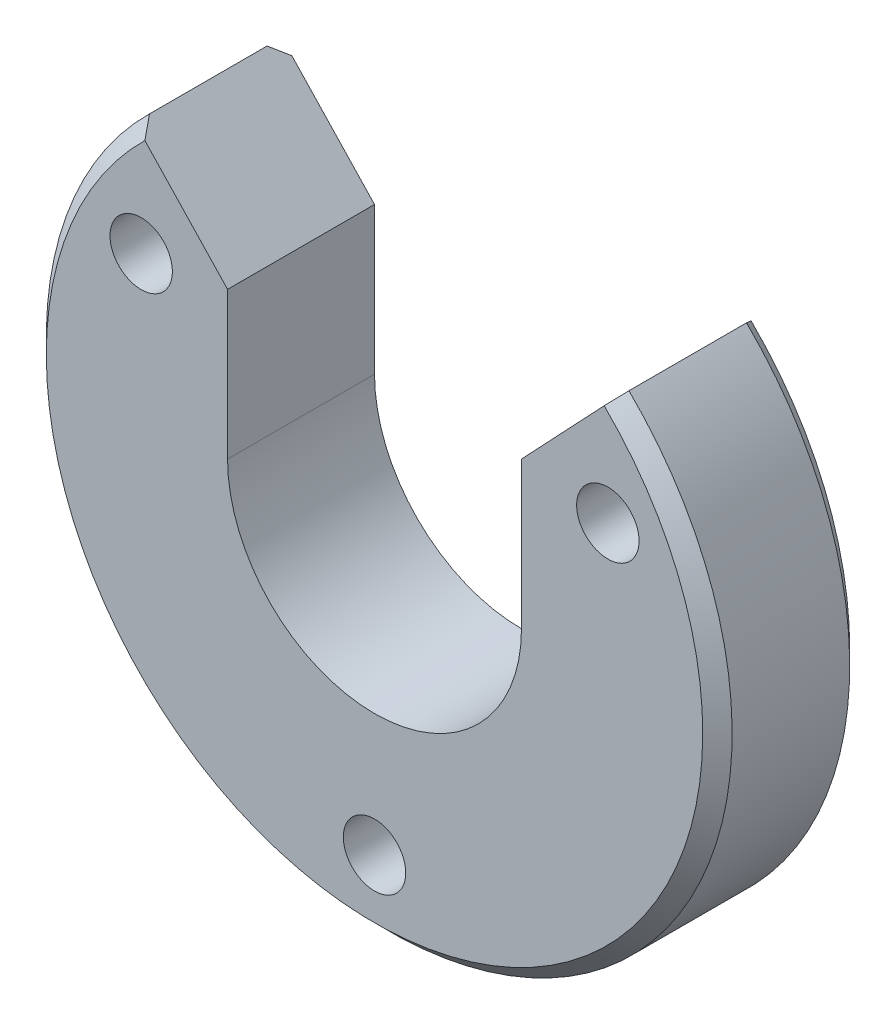
ISO-10303-21;
HEADER;
FILE_DESCRIPTION(('STEP AP214'),'2;1');
FILE_NAME('part.step','',(''),(''),'','','');
FILE_SCHEMA(('AUTOMOTIVE_DESIGN { 1 0 10303 214 1 1 1 1 }'));
ENDSEC;
DATA;
#1=APPLICATION_CONTEXT('core data for automotive mechanical design processes');
#2=APPLICATION_PROTOCOL_DEFINITION('international standard','automotive_design',2000,#1);
#3=PRODUCT_CONTEXT('',#1,'mechanical');
#4=PRODUCT('Part','Part','',(#3));
#5=PRODUCT_RELATED_PRODUCT_CATEGORY('part','',(#4));
#6=PRODUCT_DEFINITION_FORMATION('','',#4);
#7=PRODUCT_DEFINITION_CONTEXT('part definition',#1,'design');
#8=PRODUCT_DEFINITION('design','',#6,#7);
#9=PRODUCT_DEFINITION_SHAPE('','',#8);
#10=(LENGTH_UNIT() NAMED_UNIT(*) SI_UNIT(.MILLI.,.METRE.));
#11=(NAMED_UNIT(*) PLANE_ANGLE_UNIT() SI_UNIT($,.RADIAN.));
#12=(NAMED_UNIT(*) SI_UNIT($,.STERADIAN.) SOLID_ANGLE_UNIT());
#13=UNCERTAINTY_MEASURE_WITH_UNIT(LENGTH_MEASURE(1.E-05),#10,'distance_accuracy_value','');
#14=(GEOMETRIC_REPRESENTATION_CONTEXT(3) GLOBAL_UNCERTAINTY_ASSIGNED_CONTEXT((#13)) GLOBAL_UNIT_ASSIGNED_CONTEXT((#10,
#11,#12)) REPRESENTATION_CONTEXT('',''));
#15=CARTESIAN_POINT('',(0.,0.,0.));
#16=DIRECTION('',(0.,0.,1.));
#17=DIRECTION('',(1.,0.,0.));
#18=AXIS2_PLACEMENT_3D('',#15,#16,#17);
#19=CARTESIAN_POINT('',(0.,0.,6.));
#20=DIRECTION('',(0.,0.,1.));
#21=DIRECTION('',(1.,0.,0.));
#22=AXIS2_PLACEMENT_3D('',#19,#20,#21);
#23=PLANE('',#22);
#24=DIRECTION('',(0.686666900259553,-0.726972192100865,0.));
#25=VECTOR('',#24,1.);
#26=CARTESIAN_POINT('',(-6.,6.,6.));
#27=LINE('',#26,#25);
#28=CARTESIAN_POINT('',(-9.37564286444849,9.57378299724389,6.));
#29=VERTEX_POINT('',#28);
#30=CARTESIAN_POINT('',(-6.,6.,6.));
#31=VERTEX_POINT('',#30);
#32=EDGE_CURVE('E127',#29,#31,#27,.T.);
#33=ORIENTED_EDGE('',*,*,#32,.F.);
#34=CARTESIAN_POINT('',(0.,0.,6.));
#35=DIRECTION('',(0.,0.,1.));
#36=DIRECTION('',(1.,0.,0.));
#37=AXIS2_PLACEMENT_3D('',#34,#35,#36);
#38=CIRCLE('',#37,13.4);
#39=CARTESIAN_POINT('',(9.37564286444849,9.57378299724389,6.));
#40=VERTEX_POINT('',#39);
#41=EDGE_CURVE('E11',#29,#40,#38,.T.);
#42=ORIENTED_EDGE('',*,*,#41,.T.);
#43=DIRECTION('',(0.686666900259553,0.726972192100865,0.));
#44=VECTOR('',#43,1.);
#45=CARTESIAN_POINT('',(6.,6.,6.));
#46=LINE('',#45,#44);
#47=CARTESIAN_POINT('',(6.,6.,6.));
#48=VERTEX_POINT('',#47);
#49=EDGE_CURVE('E134',#48,#40,#46,.T.);
#50=ORIENTED_EDGE('',*,*,#49,.F.);
#51=DIRECTION('',(0.,1.,0.));
#52=VECTOR('',#51,1.);
#53=CARTESIAN_POINT('',(6.,0.,6.));
#54=LINE('',#53,#52);
#55=CARTESIAN_POINT('',(6.,0.,6.));
#56=VERTEX_POINT('',#55);
#57=EDGE_CURVE('E107',#56,#48,#54,.T.);
#58=ORIENTED_EDGE('',*,*,#57,.F.);
#59=CARTESIAN_POINT('',(0.,0.,6.));
#60=DIRECTION('',(0.,0.,1.));
#61=DIRECTION('',(1.,0.,0.));
#62=AXIS2_PLACEMENT_3D('',#59,#60,#61);
#63=CIRCLE('',#62,6.);
#64=CARTESIAN_POINT('',(-6.,0.,6.));
#65=VERTEX_POINT('',#64);
#66=EDGE_CURVE('E166',#65,#56,#63,.T.);
#67=ORIENTED_EDGE('',*,*,#66,.F.);
#68=DIRECTION('',(0.,-1.,0.));
#69=VECTOR('',#68,1.);
#70=CARTESIAN_POINT('',(-6.,0.,6.));
#71=LINE('',#70,#69);
#72=EDGE_CURVE('E125',#31,#65,#71,.T.);
#73=ORIENTED_EDGE('',*,*,#72,.F.);
#74=EDGE_LOOP('',(#33,#42,#50,#58,#67,#73));
#75=FACE_BOUND('',#74,.T.);
#76=CARTESIAN_POINT('',(-9.5262794416288,5.50000000000005,6.));
#77=DIRECTION('',(0.,0.,1.));
#78=DIRECTION('',(1.,0.,0.));
#79=AXIS2_PLACEMENT_3D('',#76,#77,#78);
#80=CIRCLE('',#79,1.27377118322008);
#81=CARTESIAN_POINT('',(-8.25250825840872,5.50000000000005,6.));
#82=VERTEX_POINT('',#81);
#83=EDGE_CURVE('E153',#82,#82,#80,.T.);
#84=ORIENTED_EDGE('',*,*,#83,.F.);
#85=EDGE_LOOP('',(#84));
#86=FACE_BOUND('',#85,.T.);
#87=CARTESIAN_POINT('',(9.52627944162887,5.49999999999991,6.));
#88=DIRECTION('',(0.,0.,1.));
#89=DIRECTION('',(1.,0.,0.));
#90=AXIS2_PLACEMENT_3D('',#87,#88,#89);
#91=CIRCLE('',#90,1.27377118322008);
#92=CARTESIAN_POINT('',(10.800050624849,5.49999999999991,6.));
#93=VERTEX_POINT('',#92);
#94=EDGE_CURVE('E140',#93,#93,#91,.T.);
#95=ORIENTED_EDGE('',*,*,#94,.F.);
#96=EDGE_LOOP('',(#95));
#97=FACE_BOUND('',#96,.T.);
#98=CARTESIAN_POINT('',(0.,-11.,6.));
#99=DIRECTION('',(0.,0.,1.));
#100=DIRECTION('',(1.,0.,0.));
#101=AXIS2_PLACEMENT_3D('',#98,#99,#100);
#102=CIRCLE('',#101,1.27377118322008);
#103=CARTESIAN_POINT('',(1.27377118322008,-11.,6.));
#104=VERTEX_POINT('',#103);
#105=EDGE_CURVE('E152',#104,#104,#102,.T.);
#106=ORIENTED_EDGE('',*,*,#105,.F.);
#107=EDGE_LOOP('',(#106));
#108=FACE_BOUND('',#107,.T.);
#109=ADVANCED_FACE('F33',(#75,#86,#97,#108),#23,.T.);
#110=CARTESIAN_POINT('',(0.,0.,0.));
#111=DIRECTION('',(0.,0.,1.));
#112=DIRECTION('',(1.,0.,0.));
#113=AXIS2_PLACEMENT_3D('',#110,#111,#112);
#114=PLANE('',#113);
#115=CARTESIAN_POINT('',(-9.5262794416288,5.50000000000005,0.));
#116=DIRECTION('',(0.,0.,1.));
#117=DIRECTION('',(1.,0.,0.));
#118=AXIS2_PLACEMENT_3D('',#115,#116,#117);
#119=CIRCLE('',#118,1.27377118322008);
#120=CARTESIAN_POINT('',(-8.25250825840872,5.50000000000005,0.));
#121=VERTEX_POINT('',#120);
#122=EDGE_CURVE('E149',#121,#121,#119,.T.);
#123=ORIENTED_EDGE('',*,*,#122,.T.);
#124=EDGE_LOOP('',(#123));
#125=FACE_BOUND('',#124,.T.);
#126=CARTESIAN_POINT('',(9.52627944162887,5.49999999999991,0.));
#127=DIRECTION('',(0.,0.,1.));
#128=DIRECTION('',(1.,0.,0.));
#129=AXIS2_PLACEMENT_3D('',#126,#127,#128);
#130=CIRCLE('',#129,1.27377118322008);
#131=CARTESIAN_POINT('',(10.800050624849,5.49999999999991,0.));
#132=VERTEX_POINT('',#131);
#133=EDGE_CURVE('E156',#132,#132,#130,.T.);
#134=ORIENTED_EDGE('',*,*,#133,.T.);
#135=EDGE_LOOP('',(#134));
#136=FACE_BOUND('',#135,.T.);
#137=CARTESIAN_POINT('',(0.,-11.,0.));
#138=DIRECTION('',(0.,0.,1.));
#139=DIRECTION('',(1.,0.,0.));
#140=AXIS2_PLACEMENT_3D('',#137,#138,#139);
#141=CIRCLE('',#140,1.27377118322008);
#142=CARTESIAN_POINT('',(1.27377118322008,-11.,0.));
#143=VERTEX_POINT('',#142);
#144=EDGE_CURVE('E161',#143,#143,#141,.T.);
#145=ORIENTED_EDGE('',*,*,#144,.T.);
#146=EDGE_LOOP('',(#145));
#147=FACE_BOUND('',#146,.T.);
#148=DIRECTION('',(0.686666900259553,0.726972192100865,0.));
#149=VECTOR('',#148,1.);
#150=CARTESIAN_POINT('',(6.,6.,0.));
#151=LINE('',#150,#149);
#152=CARTESIAN_POINT('',(6.,6.,0.));
#153=VERTEX_POINT('',#152);
#154=CARTESIAN_POINT('',(9.37564286444848,9.57378299724389,0.));
#155=VERTEX_POINT('',#154);
#156=EDGE_CURVE('E114',#153,#155,#151,.T.);
#157=ORIENTED_EDGE('',*,*,#156,.T.);
#158=CARTESIAN_POINT('',(0.,0.,0.));
#159=DIRECTION('',(0.,0.,1.));
#160=DIRECTION('',(1.,0.,0.));
#161=AXIS2_PLACEMENT_3D('',#158,#159,#160);
#162=CIRCLE('',#161,13.4);
#163=CARTESIAN_POINT('',(-9.37564286444848,9.57378299724389,0.));
#164=VERTEX_POINT('',#163);
#165=EDGE_CURVE('E57',#155,#164,#162,.F.);
#166=ORIENTED_EDGE('',*,*,#165,.T.);
#167=DIRECTION('',(0.686666900259553,-0.726972192100865,0.));
#168=VECTOR('',#167,1.);
#169=CARTESIAN_POINT('',(-6.,6.,0.));
#170=LINE('',#169,#168);
#171=CARTESIAN_POINT('',(-6.,6.,0.));
#172=VERTEX_POINT('',#171);
#173=EDGE_CURVE('E118',#164,#172,#170,.T.);
#174=ORIENTED_EDGE('',*,*,#173,.T.);
#175=DIRECTION('',(0.,-1.,0.));
#176=VECTOR('',#175,1.);
#177=CARTESIAN_POINT('',(-6.,0.,0.));
#178=LINE('',#177,#176);
#179=CARTESIAN_POINT('',(-6.,0.,0.));
#180=VERTEX_POINT('',#179);
#181=EDGE_CURVE('E131',#172,#180,#178,.T.);
#182=ORIENTED_EDGE('',*,*,#181,.T.);
#183=CARTESIAN_POINT('',(0.,0.,0.));
#184=DIRECTION('',(0.,0.,1.));
#185=DIRECTION('',(1.,0.,0.));
#186=AXIS2_PLACEMENT_3D('',#183,#184,#185);
#187=CIRCLE('',#186,6.);
#188=CARTESIAN_POINT('',(6.,0.,0.));
#189=VERTEX_POINT('',#188);
#190=EDGE_CURVE('E124',#180,#189,#187,.T.);
#191=ORIENTED_EDGE('',*,*,#190,.T.);
#192=DIRECTION('',(0.,1.,0.));
#193=VECTOR('',#192,1.);
#194=CARTESIAN_POINT('',(6.,0.,0.));
#195=LINE('',#194,#193);
#196=EDGE_CURVE('E104',#189,#153,#195,.T.);
#197=ORIENTED_EDGE('',*,*,#196,.T.);
#198=EDGE_LOOP('',(#157,#166,#174,#182,#191,#197));
#199=FACE_BOUND('',#198,.T.);
#200=ADVANCED_FACE('F121',(#125,#136,#147,#199),#114,.F.);
#201=CARTESIAN_POINT('',(0.,0.,6.));
#202=DIRECTION('',(0.,0.,-1.));
#203=DIRECTION('',(-1.,0.,0.));
#204=AXIS2_PLACEMENT_3D('',#201,#202,#203);
#205=CYLINDRICAL_SURFACE('',#204,14.);
#206=DIRECTION('',(0.,0.,1.));
#207=VECTOR('',#206,1.);
#208=CARTESIAN_POINT('',(-9.78770723828293,10.0100343165078,0.));
#209=LINE('',#208,#207);
#210=CARTESIAN_POINT('',(-9.78770723828293,10.0100343165078,0.600000000000002));
#211=VERTEX_POINT('',#210);
#212=CARTESIAN_POINT('',(-9.78770723828293,10.0100343165078,5.4));
#213=VERTEX_POINT('',#212);
#214=EDGE_CURVE('E144',#211,#213,#209,.T.);
#215=ORIENTED_EDGE('',*,*,#214,.F.);
#216=CARTESIAN_POINT('',(0.,0.,0.600000000000002));
#217=DIRECTION('',(0.,0.,1.));
#218=DIRECTION('',(1.,0.,0.));
#219=AXIS2_PLACEMENT_3D('',#216,#217,#218);
#220=CIRCLE('',#219,14.);
#221=CARTESIAN_POINT('',(9.78770723828293,10.0100343165078,0.600000000000002));
#222=VERTEX_POINT('',#221);
#223=EDGE_CURVE('E172',#211,#222,#220,.T.);
#224=ORIENTED_EDGE('',*,*,#223,.T.);
#225=DIRECTION('',(0.,0.,1.));
#226=VECTOR('',#225,1.);
#227=CARTESIAN_POINT('',(9.78770723828293,10.0100343165078,0.));
#228=LINE('',#227,#226);
#229=CARTESIAN_POINT('',(9.78770723828293,10.0100343165078,5.4));
#230=VERTEX_POINT('',#229);
#231=EDGE_CURVE('E111',#222,#230,#228,.T.);
#232=ORIENTED_EDGE('',*,*,#231,.T.);
#233=CARTESIAN_POINT('',(0.,0.,5.4));
#234=DIRECTION('',(0.,0.,1.));
#235=DIRECTION('',(1.,0.,0.));
#236=AXIS2_PLACEMENT_3D('',#233,#234,#235);
#237=CIRCLE('',#236,14.);
#238=EDGE_CURVE('E169',#230,#213,#237,.F.);
#239=ORIENTED_EDGE('',*,*,#238,.T.);
#240=EDGE_LOOP('',(#215,#224,#232,#239));
#241=FACE_BOUND('',#240,.T.);
#242=ADVANCED_FACE('F211',(#241),#205,.T.);
#243=CARTESIAN_POINT('',(0.,0.,6.));
#244=DIRECTION('',(0.,0.,-1.));
#245=DIRECTION('',(-1.,0.,0.));
#246=AXIS2_PLACEMENT_3D('',#243,#244,#245);
#247=CYLINDRICAL_SURFACE('',#246,6.);
#248=DIRECTION('',(0.,0.,1.));
#249=VECTOR('',#248,1.);
#250=CARTESIAN_POINT('',(-6.,0.,0.));
#251=LINE('',#250,#249);
#252=EDGE_CURVE('E137',#180,#65,#251,.T.);
#253=ORIENTED_EDGE('',*,*,#252,.T.);
#254=ORIENTED_EDGE('',*,*,#66,.T.);
#255=DIRECTION('',(0.,0.,1.));
#256=VECTOR('',#255,1.);
#257=CARTESIAN_POINT('',(6.,0.,0.));
#258=LINE('',#257,#256);
#259=EDGE_CURVE('E112',#189,#56,#258,.T.);
#260=ORIENTED_EDGE('',*,*,#259,.F.);
#261=ORIENTED_EDGE('',*,*,#190,.F.);
#262=EDGE_LOOP('',(#253,#254,#260,#261));
#263=FACE_BOUND('',#262,.T.);
#264=ADVANCED_FACE('F207',(#263),#247,.F.);
#265=CARTESIAN_POINT('',(0.,-11.,0.));
#266=DIRECTION('',(0.,0.,1.));
#267=DIRECTION('',(1.,0.,0.));
#268=AXIS2_PLACEMENT_3D('',#265,#266,#267);
#269=CYLINDRICAL_SURFACE('',#268,1.27377118322008);
#270=ORIENTED_EDGE('',*,*,#144,.F.);
#271=EDGE_LOOP('',(#270));
#272=FACE_BOUND('',#271,.T.);
#273=ORIENTED_EDGE('',*,*,#105,.T.);
#274=EDGE_LOOP('',(#273));
#275=FACE_BOUND('',#274,.T.);
#276=ADVANCED_FACE('F203',(#272,#275),#269,.F.);
#277=CARTESIAN_POINT('',(9.52627944162887,5.49999999999991,0.));
#278=DIRECTION('',(0.,0.,1.));
#279=DIRECTION('',(1.,0.,0.));
#280=AXIS2_PLACEMENT_3D('',#277,#278,#279);
#281=CYLINDRICAL_SURFACE('',#280,1.27377118322008);
#282=ORIENTED_EDGE('',*,*,#133,.F.);
#283=EDGE_LOOP('',(#282));
#284=FACE_BOUND('',#283,.T.);
#285=ORIENTED_EDGE('',*,*,#94,.T.);
#286=EDGE_LOOP('',(#285));
#287=FACE_BOUND('',#286,.T.);
#288=ADVANCED_FACE('F199',(#284,#287),#281,.F.);
#289=CARTESIAN_POINT('',(-9.5262794416288,5.50000000000005,0.));
#290=DIRECTION('',(0.,0.,1.));
#291=DIRECTION('',(1.,0.,0.));
#292=AXIS2_PLACEMENT_3D('',#289,#290,#291);
#293=CYLINDRICAL_SURFACE('',#292,1.27377118322008);
#294=ORIENTED_EDGE('',*,*,#122,.F.);
#295=EDGE_LOOP('',(#294));
#296=FACE_BOUND('',#295,.T.);
#297=ORIENTED_EDGE('',*,*,#83,.T.);
#298=EDGE_LOOP('',(#297));
#299=FACE_BOUND('',#298,.T.);
#300=ADVANCED_FACE('F196',(#296,#299),#293,.F.);
#301=CARTESIAN_POINT('',(6.,0.,0.));
#302=DIRECTION('',(1.,0.,0.));
#303=DIRECTION('',(0.,0.,-1.));
#304=AXIS2_PLACEMENT_3D('',#301,#302,#303);
#305=PLANE('',#304);
#306=ORIENTED_EDGE('',*,*,#57,.T.);
#307=DIRECTION('',(0.,0.,1.));
#308=VECTOR('',#307,1.);
#309=CARTESIAN_POINT('',(6.,6.,0.));
#310=LINE('',#309,#308);
#311=EDGE_CURVE('E100',#153,#48,#310,.T.);
#312=ORIENTED_EDGE('',*,*,#311,.F.);
#313=ORIENTED_EDGE('',*,*,#196,.F.);
#314=ORIENTED_EDGE('',*,*,#259,.T.);
#315=EDGE_LOOP('',(#306,#312,#313,#314));
#316=FACE_BOUND('',#315,.T.);
#317=ADVANCED_FACE('F102',(#316),#305,.F.);
#318=CARTESIAN_POINT('',(6.,6.,0.));
#319=DIRECTION('',(0.726972192100865,-0.686666900259553,0.));
#320=DIRECTION('',(0.686666900259553,0.726972192100865,0.));
#321=AXIS2_PLACEMENT_3D('',#318,#319,#320);
#322=PLANE('',#321);
#323=ORIENTED_EDGE('',*,*,#231,.F.);
#324=CARTESIAN_POINT('',(9.78770723828293,10.0100343165078,0.600000000000002));
#325=CARTESIAN_POINT('',(9.71903007709161,9.9373260115063,0.499999658518122));
#326=CARTESIAN_POINT('',(9.65035279867642,9.86461758240022,0.399999487777185));
#327=CARTESIAN_POINT('',(9.51299800739828,9.71920047597891,0.199999487777185));
#328=CARTESIAN_POINT('',(9.44432049453532,9.64649179866368,0.0999996585181211));
#329=CARTESIAN_POINT('',(9.37564286444848,9.57378299724389,0.));
#330=B_SPLINE_CURVE_WITH_KNOTS('',3,(#324,#325,#326,#327,#328,#329),.UNSPECIFIED.,.F.,.F.,(4,2,
4),(0.,0.4242971428566,0.848594285713254),.UNSPECIFIED.);
#331=EDGE_CURVE('E117',#222,#155,#330,.T.);
#332=ORIENTED_EDGE('',*,*,#331,.T.);
#333=ORIENTED_EDGE('',*,*,#156,.F.);
#334=ORIENTED_EDGE('',*,*,#311,.T.);
#335=ORIENTED_EDGE('',*,*,#49,.T.);
#336=CARTESIAN_POINT('',(9.37564286444849,9.57378299724389,6.));
#337=CARTESIAN_POINT('',(9.44432049453532,9.64649179866369,5.90000034148188));
#338=CARTESIAN_POINT('',(9.51299800739828,9.71920047597891,5.80000051222282));
#339=CARTESIAN_POINT('',(9.65035279867642,9.86461758240022,5.60000051222281));
#340=CARTESIAN_POINT('',(9.71903007709162,9.9373260115063,5.50000034148188));
#341=CARTESIAN_POINT('',(9.78770723828293,10.0100343165078,5.4));
#342=B_SPLINE_CURVE_WITH_KNOTS('',3,(#336,#337,#338,#339,#340,#341),.UNSPECIFIED.,.F.,.F.,(4,2,
4),(0.,0.424297142856652,0.848594285713249),.UNSPECIFIED.);
#343=EDGE_CURVE('E175',#40,#230,#342,.T.);
#344=ORIENTED_EDGE('',*,*,#343,.T.);
#345=EDGE_LOOP('',(#323,#332,#333,#334,#335,#344));
#346=FACE_BOUND('',#345,.T.);
#347=ADVANCED_FACE('F116',(#346),#322,.F.);
#348=CARTESIAN_POINT('',(-6.,0.,0.));
#349=DIRECTION('',(-1.,0.,0.));
#350=DIRECTION('',(0.,0.,1.));
#351=AXIS2_PLACEMENT_3D('',#348,#349,#350);
#352=PLANE('',#351);
#353=ORIENTED_EDGE('',*,*,#72,.T.);
#354=ORIENTED_EDGE('',*,*,#252,.F.);
#355=ORIENTED_EDGE('',*,*,#181,.F.);
#356=DIRECTION('',(0.,0.,1.));
#357=VECTOR('',#356,1.);
#358=CARTESIAN_POINT('',(-6.,6.,0.));
#359=LINE('',#358,#357);
#360=EDGE_CURVE('E141',#172,#31,#359,.T.);
#361=ORIENTED_EDGE('',*,*,#360,.T.);
#362=EDGE_LOOP('',(#353,#354,#355,#361));
#363=FACE_BOUND('',#362,.T.);
#364=ADVANCED_FACE('F189',(#363),#352,.F.);
#365=CARTESIAN_POINT('',(-6.,6.,0.));
#366=DIRECTION('',(-0.726972192100865,-0.686666900259553,0.));
#367=DIRECTION('',(0.686666900259553,-0.726972192100865,0.));
#368=AXIS2_PLACEMENT_3D('',#365,#366,#367);
#369=PLANE('',#368);
#370=ORIENTED_EDGE('',*,*,#173,.F.);
#371=CARTESIAN_POINT('',(-9.37564286444848,9.57378299724389,0.));
#372=CARTESIAN_POINT('',(-9.44432049453532,9.64649179866368,0.0999996585181206));
#373=CARTESIAN_POINT('',(-9.51299800739828,9.71920047597891,0.199999487777184));
#374=CARTESIAN_POINT('',(-9.65035279867642,9.86461758240022,0.399999487777185));
#375=CARTESIAN_POINT('',(-9.71903007709162,9.9373260115063,0.499999658518121));
#376=CARTESIAN_POINT('',(-9.78770723828293,10.0100343165078,0.600000000000001));
#377=B_SPLINE_CURVE_WITH_KNOTS('',3,(#371,#372,#373,#374,#375,#376),.UNSPECIFIED.,.F.,.F.,(4,2,
4),(0.,0.424297142856653,0.848594285713254),.UNSPECIFIED.);
#378=EDGE_CURVE('E42',#164,#211,#377,.T.);
#379=ORIENTED_EDGE('',*,*,#378,.T.);
#380=ORIENTED_EDGE('',*,*,#214,.T.);
#381=CARTESIAN_POINT('',(-9.78770723828293,10.0100343165078,5.4));
#382=CARTESIAN_POINT('',(-9.71903007709162,9.9373260115063,5.50000034148188));
#383=CARTESIAN_POINT('',(-9.65035279867642,9.86461758240022,5.60000051222282));
#384=CARTESIAN_POINT('',(-9.51299800739828,9.71920047597891,5.80000051222282));
#385=CARTESIAN_POINT('',(-9.44432049453532,9.64649179866368,5.90000034148188));
#386=CARTESIAN_POINT('',(-9.37564286444849,9.57378299724389,6.));
#387=B_SPLINE_CURVE_WITH_KNOTS('',3,(#381,#382,#383,#384,#385,#386),.UNSPECIFIED.,.F.,.F.,(4,2,
4),(0.,0.424297142856598,0.84859428571325),.UNSPECIFIED.);
#388=EDGE_CURVE('E49',#213,#29,#387,.T.);
#389=ORIENTED_EDGE('',*,*,#388,.T.);
#390=ORIENTED_EDGE('',*,*,#32,.T.);
#391=ORIENTED_EDGE('',*,*,#360,.F.);
#392=EDGE_LOOP('',(#370,#379,#380,#389,#390,#391));
#393=FACE_BOUND('',#392,.T.);
#394=ADVANCED_FACE('F190',(#393),#369,.F.);
#395=CARTESIAN_POINT('',(0.,0.,0.600000000000002));
#396=DIRECTION('',(0.,0.,1.));
#397=DIRECTION('',(1.,0.,0.));
#398=AXIS2_PLACEMENT_3D('',#395,#396,#397);
#399=CONICAL_SURFACE('',#398,14.,0.785398163397451);
#400=ORIENTED_EDGE('',*,*,#378,.F.);
#401=ORIENTED_EDGE('',*,*,#165,.F.);
#402=ORIENTED_EDGE('',*,*,#331,.F.);
#403=ORIENTED_EDGE('',*,*,#223,.F.);
#404=EDGE_LOOP('',(#400,#401,#402,#403));
#405=FACE_BOUND('',#404,.T.);
#406=ADVANCED_FACE('F221',(#405),#399,.T.);
#407=CARTESIAN_POINT('',(0.,0.,6.));
#408=DIRECTION('',(0.,0.,-1.));
#409=DIRECTION('',(-1.,0.,0.));
#410=AXIS2_PLACEMENT_3D('',#407,#408,#409);
#411=CONICAL_SURFACE('',#410,13.4,0.78539816339745);
#412=ORIENTED_EDGE('',*,*,#388,.F.);
#413=ORIENTED_EDGE('',*,*,#238,.F.);
#414=ORIENTED_EDGE('',*,*,#343,.F.);
#415=ORIENTED_EDGE('',*,*,#41,.F.);
#416=EDGE_LOOP('',(#412,#413,#414,#415));
#417=FACE_BOUND('',#416,.T.);
#418=ADVANCED_FACE('F35',(#417),#411,.T.);
#419=CLOSED_SHELL('',(#109,#200,#242,#264,#276,#288,#300,#317,#347,#364,#394,#406,#418));
#420=MANIFOLD_SOLID_BREP('B2',#419);
#421=ADVANCED_BREP_SHAPE_REPRESENTATION('',(#18,#420),#14);
#422=SHAPE_DEFINITION_REPRESENTATION(#9,#421);
ENDSEC;
END-ISO-10303-21;
